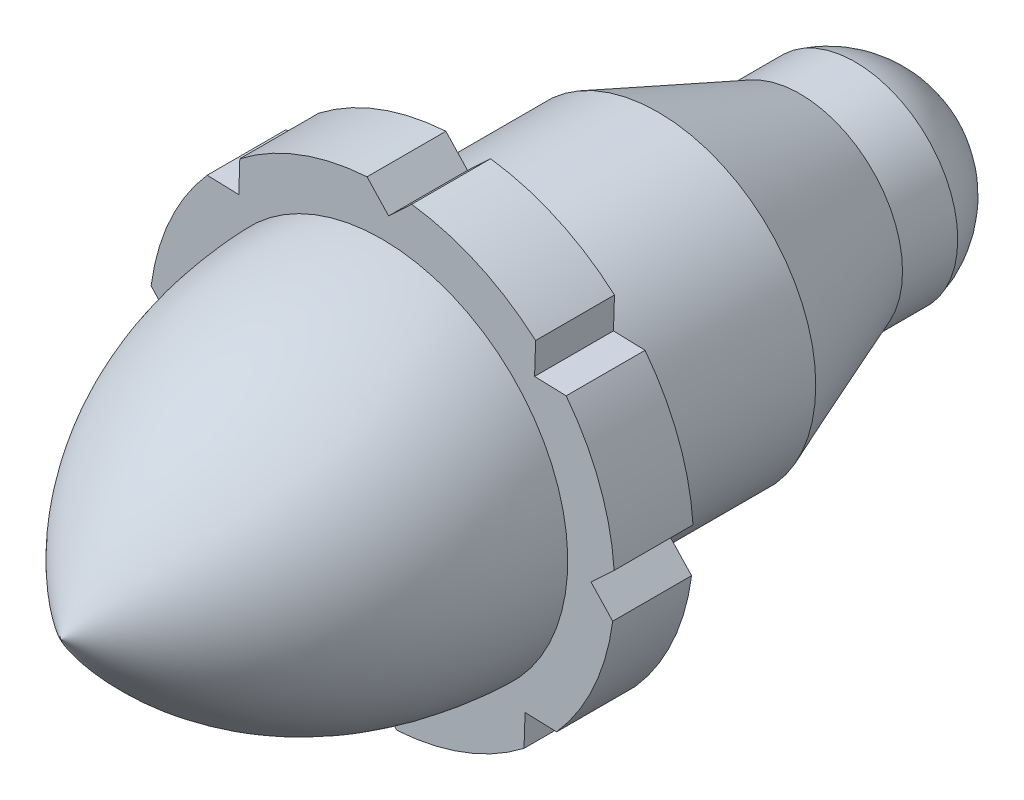
ISO-10303-21;
HEADER;
FILE_DESCRIPTION(('STEP AP214'),'2;1');
FILE_NAME('part.step','',(''),(''),'','','');
FILE_SCHEMA(('AUTOMOTIVE_DESIGN { 1 0 10303 214 1 1 1 1 }'));
ENDSEC;
DATA;
#1=APPLICATION_CONTEXT('core data for automotive mechanical design processes');
#2=APPLICATION_PROTOCOL_DEFINITION('international standard','automotive_design',2000,#1);
#3=PRODUCT_CONTEXT('',#1,'mechanical');
#4=PRODUCT('Part','Part','',(#3));
#5=PRODUCT_RELATED_PRODUCT_CATEGORY('part','',(#4));
#6=PRODUCT_DEFINITION_FORMATION('','',#4);
#7=PRODUCT_DEFINITION_CONTEXT('part definition',#1,'design');
#8=PRODUCT_DEFINITION('design','',#6,#7);
#9=PRODUCT_DEFINITION_SHAPE('','',#8);
#10=(LENGTH_UNIT() NAMED_UNIT(*) SI_UNIT(.MILLI.,.METRE.));
#11=(NAMED_UNIT(*) PLANE_ANGLE_UNIT() SI_UNIT($,.RADIAN.));
#12=(NAMED_UNIT(*) SI_UNIT($,.STERADIAN.) SOLID_ANGLE_UNIT());
#13=UNCERTAINTY_MEASURE_WITH_UNIT(LENGTH_MEASURE(1.E-05),#10,'distance_accuracy_value','');
#14=(GEOMETRIC_REPRESENTATION_CONTEXT(3) GLOBAL_UNCERTAINTY_ASSIGNED_CONTEXT((#13)) GLOBAL_UNIT_ASSIGNED_CONTEXT((#10,
#11,#12)) REPRESENTATION_CONTEXT('',''));
#15=CARTESIAN_POINT('',(0.,0.,0.));
#16=DIRECTION('',(0.,0.,1.));
#17=DIRECTION('',(1.,0.,0.));
#18=AXIS2_PLACEMENT_3D('',#15,#16,#17);
#19=CARTESIAN_POINT('',(0.,0.,12.0727628361858));
#20=DIRECTION('',(0.,0.,1.));
#21=DIRECTION('',(1.,0.,0.));
#22=AXIS2_PLACEMENT_3D('',#19,#20,#21);
#23=CYLINDRICAL_SURFACE('',#22,7.493);
#24=CARTESIAN_POINT('',(0.,0.,2.54));
#25=DIRECTION('',(0.,0.,1.));
#26=DIRECTION('',(1.,0.,0.));
#27=AXIS2_PLACEMENT_3D('',#24,#25,#26);
#28=CIRCLE('',#27,7.493);
#29=CARTESIAN_POINT('',(7.47765888228217,0.479235474716268,2.54));
#30=VERTEX_POINT('',#29);
#31=CARTESIAN_POINT('',(5.93327442458704,4.57616691156926,2.54));
#32=VERTEX_POINT('',#31);
#33=EDGE_CURVE('E310',#30,#32,#28,.T.);
#34=ORIENTED_EDGE('',*,*,#33,.F.);
#35=DIRECTION('',(0.,0.,1.));
#36=VECTOR('',#35,1.);
#37=CARTESIAN_POINT('',(7.47765888228217,0.479235474716268,-15.24));
#38=LINE('',#37,#36);
#39=CARTESIAN_POINT('',(7.47765888228217,0.479235474716268,0.));
#40=VERTEX_POINT('',#39);
#41=EDGE_CURVE('E312',#40,#30,#38,.T.);
#42=ORIENTED_EDGE('',*,*,#41,.F.);
#43=CARTESIAN_POINT('',(0.,0.,0.));
#44=DIRECTION('',(0.,0.,1.));
#45=DIRECTION('',(1.,0.,0.));
#46=AXIS2_PLACEMENT_3D('',#43,#44,#45);
#47=CIRCLE('',#46,7.493);
#48=CARTESIAN_POINT('',(5.93327442458704,4.57616691156926,0.));
#49=VERTEX_POINT('',#48);
#50=EDGE_CURVE('E635',#40,#49,#47,.T.);
#51=ORIENTED_EDGE('',*,*,#50,.T.);
#52=DIRECTION('',(0.,0.,1.));
#53=VECTOR('',#52,1.);
#54=CARTESIAN_POINT('',(5.93327442458704,4.57616691156926,-15.24));
#55=LINE('',#54,#53);
#56=EDGE_CURVE('E313',#49,#32,#55,.T.);
#57=ORIENTED_EDGE('',*,*,#56,.T.);
#58=EDGE_LOOP('',(#34,#42,#51,#57));
#59=FACE_BOUND('',#58,.T.);
#60=ADVANCED_FACE('F46',(#59),#23,.T.);
#61=CARTESIAN_POINT('',(5.62637395701856,-4.94863264910453,0.));
#62=VERTEX_POINT('',#61);
#63=CARTESIAN_POINT('',(7.43129723527833,-0.959619925254101,0.));
#64=VERTEX_POINT('',#63);
#65=EDGE_CURVE('E629',#62,#64,#47,.T.);
#66=ORIENTED_EDGE('',*,*,#65,.T.);
#67=DIRECTION('',(0.,0.,1.));
#68=VECTOR('',#67,1.);
#69=CARTESIAN_POINT('',(7.43129723527833,-0.959619925254101,-15.24));
#70=LINE('',#69,#68);
#71=CARTESIAN_POINT('',(7.43129723527833,-0.959619925254101,2.54));
#72=VERTEX_POINT('',#71);
#73=EDGE_CURVE('E699',#64,#72,#70,.T.);
#74=ORIENTED_EDGE('',*,*,#73,.T.);
#75=CARTESIAN_POINT('',(5.62637395701856,-4.94863264910453,2.54));
#76=VERTEX_POINT('',#75);
#77=EDGE_CURVE('E316',#76,#72,#28,.T.);
#78=ORIENTED_EDGE('',*,*,#77,.F.);
#79=DIRECTION('',(0.,0.,1.));
#80=VECTOR('',#79,1.);
#81=CARTESIAN_POINT('',(5.62637395701856,-4.94863264910453,-15.24));
#82=LINE('',#81,#80);
#83=EDGE_CURVE('E724',#62,#76,#82,.T.);
#84=ORIENTED_EDGE('',*,*,#83,.F.);
#85=EDGE_LOOP('',(#66,#74,#78,#84));
#86=FACE_BOUND('',#85,.T.);
#87=ADVANCED_FACE('F298',(#86),#23,.T.);
#88=CARTESIAN_POINT('',(0.479235474716294,-7.47765888228217,0.));
#89=VERTEX_POINT('',#88);
#90=CARTESIAN_POINT('',(4.57616691156924,-5.93327442458706,0.));
#91=VERTEX_POINT('',#90);
#92=EDGE_CURVE('E620',#89,#91,#47,.T.);
#93=ORIENTED_EDGE('',*,*,#92,.T.);
#94=DIRECTION('',(0.,0.,1.));
#95=VECTOR('',#94,1.);
#96=CARTESIAN_POINT('',(4.57616691156924,-5.93327442458706,-15.24));
#97=LINE('',#96,#95);
#98=CARTESIAN_POINT('',(4.57616691156924,-5.93327442458706,2.54));
#99=VERTEX_POINT('',#98);
#100=EDGE_CURVE('E622',#91,#99,#97,.T.);
#101=ORIENTED_EDGE('',*,*,#100,.T.);
#102=CARTESIAN_POINT('',(0.479235474716294,-7.47765888228217,2.54));
#103=VERTEX_POINT('',#102);
#104=EDGE_CURVE('E320',#103,#99,#28,.T.);
#105=ORIENTED_EDGE('',*,*,#104,.F.);
#106=DIRECTION('',(0.,0.,1.));
#107=VECTOR('',#106,1.);
#108=CARTESIAN_POINT('',(0.479235474716294,-7.47765888228217,-15.24));
#109=LINE('',#108,#107);
#110=EDGE_CURVE('E624',#89,#103,#109,.T.);
#111=ORIENTED_EDGE('',*,*,#110,.F.);
#112=EDGE_LOOP('',(#93,#101,#105,#111));
#113=FACE_BOUND('',#112,.T.);
#114=ADVANCED_FACE('F304',(#113),#23,.T.);
#115=CARTESIAN_POINT('',(-4.94863264910455,-5.62637395701855,0.));
#116=VERTEX_POINT('',#115);
#117=CARTESIAN_POINT('',(-0.959619925254075,-7.43129723527833,0.));
#118=VERTEX_POINT('',#117);
#119=EDGE_CURVE('E628',#116,#118,#47,.T.);
#120=ORIENTED_EDGE('',*,*,#119,.T.);
#121=DIRECTION('',(0.,0.,1.));
#122=VECTOR('',#121,1.);
#123=CARTESIAN_POINT('',(-0.959619925254075,-7.43129723527833,-15.24));
#124=LINE('',#123,#122);
#125=CARTESIAN_POINT('',(-0.959619925254075,-7.43129723527833,2.54));
#126=VERTEX_POINT('',#125);
#127=EDGE_CURVE('E740',#118,#126,#124,.T.);
#128=ORIENTED_EDGE('',*,*,#127,.T.);
#129=CARTESIAN_POINT('',(-4.94863264910455,-5.62637395701855,2.54));
#130=VERTEX_POINT('',#129);
#131=EDGE_CURVE('E250',#130,#126,#28,.T.);
#132=ORIENTED_EDGE('',*,*,#131,.F.);
#133=DIRECTION('',(0.,0.,1.));
#134=VECTOR('',#133,1.);
#135=CARTESIAN_POINT('',(-4.94863264910455,-5.62637395701855,-15.24));
#136=LINE('',#135,#134);
#137=EDGE_CURVE('E771',#116,#130,#136,.T.);
#138=ORIENTED_EDGE('',*,*,#137,.F.);
#139=EDGE_LOOP('',(#120,#128,#132,#138));
#140=FACE_BOUND('',#139,.T.);
#141=ADVANCED_FACE('F588',(#140),#23,.T.);
#142=CARTESIAN_POINT('',(-7.47765888228218,-0.479235474716216,0.));
#143=VERTEX_POINT('',#142);
#144=CARTESIAN_POINT('',(-5.93327442458708,-4.57616691156921,0.));
#145=VERTEX_POINT('',#144);
#146=EDGE_CURVE('E633',#143,#145,#47,.T.);
#147=ORIENTED_EDGE('',*,*,#146,.T.);
#148=DIRECTION('',(0.,0.,1.));
#149=VECTOR('',#148,1.);
#150=CARTESIAN_POINT('',(-5.93327442458708,-4.57616691156921,-15.24));
#151=LINE('',#150,#149);
#152=CARTESIAN_POINT('',(-5.93327442458708,-4.57616691156921,2.54));
#153=VERTEX_POINT('',#152);
#154=EDGE_CURVE('E763',#145,#153,#151,.T.);
#155=ORIENTED_EDGE('',*,*,#154,.T.);
#156=CARTESIAN_POINT('',(-7.47765888228218,-0.479235474716216,2.54));
#157=VERTEX_POINT('',#156);
#158=EDGE_CURVE('E243',#157,#153,#28,.T.);
#159=ORIENTED_EDGE('',*,*,#158,.F.);
#160=DIRECTION('',(0.,0.,1.));
#161=VECTOR('',#160,1.);
#162=CARTESIAN_POINT('',(-7.47765888228218,-0.479235474716216,-15.24));
#163=LINE('',#162,#161);
#164=EDGE_CURVE('E790',#143,#157,#163,.T.);
#165=ORIENTED_EDGE('',*,*,#164,.F.);
#166=EDGE_LOOP('',(#147,#155,#159,#165));
#167=FACE_BOUND('',#166,.T.);
#168=ADVANCED_FACE('F580',(#167),#23,.T.);
#169=CARTESIAN_POINT('',(-5.62637395701853,4.94863264910457,0.));
#170=VERTEX_POINT('',#169);
#171=CARTESIAN_POINT('',(-7.43129723527832,0.959619925254153,0.));
#172=VERTEX_POINT('',#171);
#173=EDGE_CURVE('E56',#170,#172,#47,.T.);
#174=ORIENTED_EDGE('',*,*,#173,.T.);
#175=DIRECTION('',(0.,0.,1.));
#176=VECTOR('',#175,1.);
#177=CARTESIAN_POINT('',(-7.43129723527832,0.959619925254153,-15.24));
#178=LINE('',#177,#176);
#179=CARTESIAN_POINT('',(-7.43129723527832,0.959619925254153,2.54));
#180=VERTEX_POINT('',#179);
#181=EDGE_CURVE('E217',#172,#180,#178,.T.);
#182=ORIENTED_EDGE('',*,*,#181,.T.);
#183=CARTESIAN_POINT('',(-5.62637395701853,4.94863264910457,2.54));
#184=VERTEX_POINT('',#183);
#185=EDGE_CURVE('E231',#184,#180,#28,.T.);
#186=ORIENTED_EDGE('',*,*,#185,.F.);
#187=DIRECTION('',(0.,0.,1.));
#188=VECTOR('',#187,1.);
#189=CARTESIAN_POINT('',(-5.62637395701853,4.94863264910457,-15.24));
#190=LINE('',#189,#188);
#191=EDGE_CURVE('E678',#170,#184,#190,.T.);
#192=ORIENTED_EDGE('',*,*,#191,.F.);
#193=EDGE_LOOP('',(#174,#182,#186,#192));
#194=FACE_BOUND('',#193,.T.);
#195=ADVANCED_FACE('F229',(#194),#23,.T.);
#196=CARTESIAN_POINT('',(4.94863264910451,5.62637395701858,2.54));
#197=VERTEX_POINT('',#196);
#198=CARTESIAN_POINT('',(0.959619925254075,7.43129723527833,2.54));
#199=VERTEX_POINT('',#198);
#200=EDGE_CURVE('E248',#197,#199,#28,.T.);
#201=ORIENTED_EDGE('',*,*,#200,.F.);
#202=DIRECTION('',(0.,0.,1.));
#203=VECTOR('',#202,1.);
#204=CARTESIAN_POINT('',(4.94863264910451,5.62637395701858,-15.24));
#205=LINE('',#204,#203);
#206=CARTESIAN_POINT('',(4.94863264910451,5.62637395701858,0.));
#207=VERTEX_POINT('',#206);
#208=EDGE_CURVE('E651',#207,#197,#205,.T.);
#209=ORIENTED_EDGE('',*,*,#208,.F.);
#210=CARTESIAN_POINT('',(0.959619925254075,7.43129723527833,0.));
#211=VERTEX_POINT('',#210);
#212=EDGE_CURVE('E57',#207,#211,#47,.T.);
#213=ORIENTED_EDGE('',*,*,#212,.T.);
#214=DIRECTION('',(0.,0.,1.));
#215=VECTOR('',#214,1.);
#216=CARTESIAN_POINT('',(0.959619925254075,7.43129723527833,-15.24));
#217=LINE('',#216,#215);
#218=EDGE_CURVE('E334',#211,#199,#217,.T.);
#219=ORIENTED_EDGE('',*,*,#218,.T.);
#220=EDGE_LOOP('',(#201,#209,#213,#219));
#221=FACE_BOUND('',#220,.T.);
#222=ADVANCED_FACE('F288',(#221),#23,.T.);
#223=CARTESIAN_POINT('',(0.,7.493,0.));
#224=DIRECTION('',(0.,0.,1.));
#225=DIRECTION('',(1.,0.,0.));
#226=AXIS2_PLACEMENT_3D('',#223,#224,#225);
#227=PLANE('',#226);
#228=ORIENTED_EDGE('',*,*,#50,.F.);
#229=DIRECTION('',(-0.729512016376307,-0.683967994837898,0.));
#230=VECTOR('',#229,1.);
#231=CARTESIAN_POINT('',(7.24670252932044,0.262697912504509,0.));
#232=LINE('',#231,#230);
#233=CARTESIAN_POINT('',(6.73505035879506,-0.217011401766994,0.));
#234=VERTEX_POINT('',#233);
#235=EDGE_CURVE('E644',#40,#234,#232,.T.);
#236=ORIENTED_EDGE('',*,*,#235,.T.);
#237=DIRECTION('',(0.6839679948379,-0.729512016376305,0.));
#238=VECTOR('',#237,1.);
#239=CARTESIAN_POINT('',(6.98134782947463,-0.47970931427153,0.));
#240=LINE('',#239,#238);
#241=EDGE_CURVE('E702',#234,#64,#240,.T.);
#242=ORIENTED_EDGE('',*,*,#241,.T.);
#243=ORIENTED_EDGE('',*,*,#65,.F.);
#244=DIRECTION('',(-0.999481301001201,0.0322044864723174,0.));
#245=VECTOR('',#244,1.);
#246=CARTESIAN_POINT('',(5.30994797505967,-4.93843702438871,0.));
#247=LINE('',#246,#245);
#248=CARTESIAN_POINT('',(4.60894954655263,-4.91585001412113,0.));
#249=VERTEX_POINT('',#248);
#250=EDGE_CURVE('E696',#62,#249,#247,.T.);
#251=ORIENTED_EDGE('',*,*,#250,.T.);
#252=DIRECTION('',(-0.0322044864723141,-0.999481301001202,0.));
#253=VECTOR('',#252,1.);
#254=CARTESIAN_POINT('',(4.59735268292374,-5.27576410116325,0.));
#255=LINE('',#254,#253);
#256=EDGE_CURVE('E721',#249,#91,#255,.T.);
#257=ORIENTED_EDGE('',*,*,#256,.T.);
#258=ORIENTED_EDGE('',*,*,#92,.F.);
#259=DIRECTION('',(-0.6839679948379,0.729512016376305,0.));
#260=VECTOR('',#259,1.);
#261=CARTESIAN_POINT('',(0.262697912504535,-7.24670252932044,0.));
#262=LINE('',#261,#260);
#263=CARTESIAN_POINT('',(-0.217011401766971,-6.73505035879507,0.));
#264=VERTEX_POINT('',#263);
#265=EDGE_CURVE('E716',#89,#264,#262,.T.);
#266=ORIENTED_EDGE('',*,*,#265,.T.);
#267=DIRECTION('',(-0.729512016376303,-0.683967994837903,0.));
#268=VECTOR('',#267,1.);
#269=CARTESIAN_POINT('',(-0.479709314271506,-6.98134782947463,0.));
#270=LINE('',#269,#268);
#271=EDGE_CURVE('E744',#264,#118,#270,.T.);
#272=ORIENTED_EDGE('',*,*,#271,.T.);
#273=ORIENTED_EDGE('',*,*,#119,.F.);
#274=DIRECTION('',(0.0322044864723209,0.999481301001201,0.));
#275=VECTOR('',#274,1.);
#276=CARTESIAN_POINT('',(-4.93843702438873,-5.30994797505965,0.));
#277=LINE('',#276,#275);
#278=CARTESIAN_POINT('',(-4.91585001412114,-4.60894954655261,0.));
#279=VERTEX_POINT('',#278);
#280=EDGE_CURVE('E736',#116,#279,#277,.T.);
#281=ORIENTED_EDGE('',*,*,#280,.T.);
#282=DIRECTION('',(-0.999481301001201,0.0322044864723175,0.));
#283=VECTOR('',#282,1.);
#284=CARTESIAN_POINT('',(-5.27576410116326,-4.59735268292372,0.));
#285=LINE('',#284,#283);
#286=EDGE_CURVE('E767',#279,#145,#285,.T.);
#287=ORIENTED_EDGE('',*,*,#286,.T.);
#288=ORIENTED_EDGE('',*,*,#146,.F.);
#289=DIRECTION('',(0.729512016376312,0.683967994837893,0.));
#290=VECTOR('',#289,1.);
#291=CARTESIAN_POINT('',(-7.24670252932044,-0.262697912504459,0.));
#292=LINE('',#291,#290);
#293=CARTESIAN_POINT('',(-6.73505035879506,0.217011401767041,0.));
#294=VERTEX_POINT('',#293);
#295=EDGE_CURVE('E759',#143,#294,#292,.T.);
#296=ORIENTED_EDGE('',*,*,#295,.T.);
#297=DIRECTION('',(-0.683967994837895,0.72951201637631,0.));
#298=VECTOR('',#297,1.);
#299=CARTESIAN_POINT('',(-6.98134782947462,0.479709314271579,0.));
#300=LINE('',#299,#298);
#301=EDGE_CURVE('E234',#294,#172,#300,.T.);
#302=ORIENTED_EDGE('',*,*,#301,.T.);
#303=ORIENTED_EDGE('',*,*,#173,.F.);
#304=DIRECTION('',(0.999481301001201,-0.0322044864723243,0.));
#305=VECTOR('',#304,1.);
#306=CARTESIAN_POINT('',(-5.30994797505964,4.93843702438875,0.));
#307=LINE('',#306,#305);
#308=CARTESIAN_POINT('',(-4.6089495465526,4.91585001412116,0.));
#309=VERTEX_POINT('',#308);
#310=EDGE_CURVE('E224',#170,#309,#307,.T.);
#311=ORIENTED_EDGE('',*,*,#310,.T.);
#312=DIRECTION('',(0.0322044864723209,0.999481301001201,0.));
#313=VECTOR('',#312,1.);
#314=CARTESIAN_POINT('',(-4.5973526829237,5.27576410116328,0.));
#315=LINE('',#314,#313);
#316=CARTESIAN_POINT('',(-4.5761669115692,5.93327442458709,0.));
#317=VERTEX_POINT('',#316);
#318=EDGE_CURVE('E673',#309,#317,#315,.T.);
#319=ORIENTED_EDGE('',*,*,#318,.T.);
#320=CARTESIAN_POINT('',(-0.479235474716294,7.47765888228217,0.));
#321=VERTEX_POINT('',#320);
#322=EDGE_CURVE('E12',#321,#317,#47,.T.);
#323=ORIENTED_EDGE('',*,*,#322,.F.);
#324=DIRECTION('',(0.6839679948379,-0.729512016376305,0.));
#325=VECTOR('',#324,1.);
#326=CARTESIAN_POINT('',(-0.262697912504535,7.24670252932044,0.));
#327=LINE('',#326,#325);
#328=CARTESIAN_POINT('',(0.217011401766971,6.73505035879507,0.));
#329=VERTEX_POINT('',#328);
#330=EDGE_CURVE('E353',#321,#329,#327,.T.);
#331=ORIENTED_EDGE('',*,*,#330,.T.);
#332=DIRECTION('',(0.729512016376303,0.683967994837903,0.));
#333=VECTOR('',#332,1.);
#334=CARTESIAN_POINT('',(0.479709314271506,6.98134782947463,0.));
#335=LINE('',#334,#333);
#336=EDGE_CURVE('E347',#329,#211,#335,.T.);
#337=ORIENTED_EDGE('',*,*,#336,.T.);
#338=ORIENTED_EDGE('',*,*,#212,.F.);
#339=DIRECTION('',(-0.0322044864723139,-0.999481301001202,0.));
#340=VECTOR('',#339,1.);
#341=CARTESIAN_POINT('',(4.93843702438869,5.30994797505969,0.));
#342=LINE('',#341,#340);
#343=CARTESIAN_POINT('',(4.91585001412111,4.60894954655265,0.));
#344=VERTEX_POINT('',#343);
#345=EDGE_CURVE('E648',#207,#344,#342,.T.);
#346=ORIENTED_EDGE('',*,*,#345,.T.);
#347=DIRECTION('',(0.999481301001202,-0.0322044864723105,0.));
#348=VECTOR('',#347,1.);
#349=CARTESIAN_POINT('',(5.27576410116323,4.59735268292375,0.));
#350=LINE('',#349,#348);
#351=EDGE_CURVE('E647',#344,#49,#350,.T.);
#352=ORIENTED_EDGE('',*,*,#351,.T.);
#353=EDGE_LOOP('',(#228,#236,#242,#243,#251,#257,#258,#266,#272,#273,#281,#287,#288,#296,#302,
#303,#311,#319,#323,#331,#337,#338,#346,#352));
#354=FACE_BOUND('',#353,.T.);
#355=CARTESIAN_POINT('',(0.,0.,0.));
#356=DIRECTION('',(0.,0.,1.));
#357=DIRECTION('',(1.,0.,0.));
#358=AXIS2_PLACEMENT_3D('',#355,#356,#357);
#359=CIRCLE('',#358,5.08);
#360=CARTESIAN_POINT('',(5.08,0.,0.));
#361=VERTEX_POINT('',#360);
#362=EDGE_CURVE('E252',#361,#361,#359,.T.);
#363=ORIENTED_EDGE('',*,*,#362,.T.);
#364=EDGE_LOOP('',(#363));
#365=FACE_BOUND('',#364,.T.);
#366=ADVANCED_FACE('F286',(#354,#365),#227,.F.);
#367=ORIENTED_EDGE('',*,*,#322,.T.);
#368=DIRECTION('',(0.,0.,1.));
#369=VECTOR('',#368,1.);
#370=CARTESIAN_POINT('',(-4.5761669115692,5.93327442458709,-15.24));
#371=LINE('',#370,#369);
#372=CARTESIAN_POINT('',(-4.5761669115692,5.93327442458709,2.54));
#373=VERTEX_POINT('',#372);
#374=EDGE_CURVE('E669',#317,#373,#371,.T.);
#375=ORIENTED_EDGE('',*,*,#374,.T.);
#376=CARTESIAN_POINT('',(-0.479235474716294,7.47765888228217,2.54));
#377=VERTEX_POINT('',#376);
#378=EDGE_CURVE('E242',#377,#373,#28,.T.);
#379=ORIENTED_EDGE('',*,*,#378,.F.);
#380=DIRECTION('',(0.,0.,1.));
#381=VECTOR('',#380,1.);
#382=CARTESIAN_POINT('',(-0.479235474716294,7.47765888228217,-15.24));
#383=LINE('',#382,#381);
#384=EDGE_CURVE('E343',#321,#377,#383,.T.);
#385=ORIENTED_EDGE('',*,*,#384,.F.);
#386=EDGE_LOOP('',(#367,#375,#379,#385));
#387=FACE_BOUND('',#386,.T.);
#388=ADVANCED_FACE('F283',(#387),#23,.T.);
#389=CARTESIAN_POINT('',(0.,0.,2.54));
#390=DIRECTION('',(0.,0.,-1.));
#391=DIRECTION('',(-1.,0.,0.));
#392=AXIS2_PLACEMENT_3D('',#389,#390,#391);
#393=PLANE('',#392);
#394=CARTESIAN_POINT('',(0.,0.,2.54));
#395=DIRECTION('',(0.,0.,-1.));
#396=DIRECTION('',(-1.,0.,0.));
#397=AXIS2_PLACEMENT_3D('',#394,#395,#396);
#398=CIRCLE('',#397,5.98409127133929);
#399=CARTESIAN_POINT('',(-5.98409127133929,0.,2.54));
#400=VERTEX_POINT('',#399);
#401=EDGE_CURVE('E256',#400,#400,#398,.T.);
#402=ORIENTED_EDGE('',*,*,#401,.T.);
#403=EDGE_LOOP('',(#402));
#404=FACE_BOUND('',#403,.T.);
#405=DIRECTION('',(0.6839679948379,-0.729512016376305,0.));
#406=VECTOR('',#405,1.);
#407=CARTESIAN_POINT('',(6.73505035879506,-0.217011401766994,2.54));
#408=LINE('',#407,#406);
#409=CARTESIAN_POINT('',(6.73505035879506,-0.217011401766994,2.54));
#410=VERTEX_POINT('',#409);
#411=EDGE_CURVE('E692',#410,#72,#408,.T.);
#412=ORIENTED_EDGE('',*,*,#411,.F.);
#413=DIRECTION('',(-0.729512016376307,-0.683967994837897,0.));
#414=VECTOR('',#413,1.);
#415=CARTESIAN_POINT('',(6.73505035879506,-0.217011401766994,2.54));
#416=LINE('',#415,#414);
#417=EDGE_CURVE('E64',#30,#410,#416,.T.);
#418=ORIENTED_EDGE('',*,*,#417,.F.);
#419=ORIENTED_EDGE('',*,*,#33,.T.);
#420=DIRECTION('',(0.999481301001202,-0.0322044864723105,0.));
#421=VECTOR('',#420,1.);
#422=CARTESIAN_POINT('',(4.91585001412111,4.60894954655265,2.54));
#423=LINE('',#422,#421);
#424=CARTESIAN_POINT('',(4.91585001412111,4.60894954655265,2.54));
#425=VERTEX_POINT('',#424);
#426=EDGE_CURVE('E711',#425,#32,#423,.T.);
#427=ORIENTED_EDGE('',*,*,#426,.F.);
#428=DIRECTION('',(-0.0322044864723139,-0.999481301001201,0.));
#429=VECTOR('',#428,1.);
#430=CARTESIAN_POINT('',(4.91585001412111,4.60894954655265,2.54));
#431=LINE('',#430,#429);
#432=EDGE_CURVE('E327',#197,#425,#431,.T.);
#433=ORIENTED_EDGE('',*,*,#432,.F.);
#434=ORIENTED_EDGE('',*,*,#200,.T.);
#435=DIRECTION('',(0.729512016376303,0.683967994837903,0.));
#436=VECTOR('',#435,1.);
#437=CARTESIAN_POINT('',(0.217011401766971,6.73505035879507,2.54));
#438=LINE('',#437,#436);
#439=CARTESIAN_POINT('',(0.217011401766971,6.73505035879507,2.54));
#440=VERTEX_POINT('',#439);
#441=EDGE_CURVE('E326',#440,#199,#438,.T.);
#442=ORIENTED_EDGE('',*,*,#441,.F.);
#443=DIRECTION('',(0.6839679948379,-0.729512016376305,0.));
#444=VECTOR('',#443,1.);
#445=CARTESIAN_POINT('',(0.217011401766971,6.73505035879507,2.54));
#446=LINE('',#445,#444);
#447=EDGE_CURVE('E339',#377,#440,#446,.T.);
#448=ORIENTED_EDGE('',*,*,#447,.F.);
#449=ORIENTED_EDGE('',*,*,#378,.T.);
#450=DIRECTION('',(0.0322044864723209,0.999481301001201,0.));
#451=VECTOR('',#450,1.);
#452=CARTESIAN_POINT('',(-4.6089495465526,4.91585001412116,2.54));
#453=LINE('',#452,#451);
#454=CARTESIAN_POINT('',(-4.6089495465526,4.91585001412116,2.54));
#455=VERTEX_POINT('',#454);
#456=EDGE_CURVE('E681',#455,#373,#453,.T.);
#457=ORIENTED_EDGE('',*,*,#456,.F.);
#458=DIRECTION('',(0.999481301001201,-0.0322044864723243,0.));
#459=VECTOR('',#458,1.);
#460=CARTESIAN_POINT('',(-4.6089495465526,4.91585001412116,2.54));
#461=LINE('',#460,#459);
#462=EDGE_CURVE('E240',#184,#455,#461,.T.);
#463=ORIENTED_EDGE('',*,*,#462,.F.);
#464=ORIENTED_EDGE('',*,*,#185,.T.);
#465=DIRECTION('',(-0.683967994837895,0.72951201637631,0.));
#466=VECTOR('',#465,1.);
#467=CARTESIAN_POINT('',(-6.73505035879506,0.217011401767041,2.54));
#468=LINE('',#467,#466);
#469=CARTESIAN_POINT('',(-6.73505035879506,0.217011401767042,2.54));
#470=VERTEX_POINT('',#469);
#471=EDGE_CURVE('E213',#470,#180,#468,.T.);
#472=ORIENTED_EDGE('',*,*,#471,.F.);
#473=DIRECTION('',(0.729512016376312,0.683967994837892,0.));
#474=VECTOR('',#473,1.);
#475=CARTESIAN_POINT('',(-6.73505035879506,0.217011401767041,2.54));
#476=LINE('',#475,#474);
#477=EDGE_CURVE('E787',#157,#470,#476,.T.);
#478=ORIENTED_EDGE('',*,*,#477,.F.);
#479=ORIENTED_EDGE('',*,*,#158,.T.);
#480=DIRECTION('',(-0.999481301001201,0.0322044864723175,0.));
#481=VECTOR('',#480,1.);
#482=CARTESIAN_POINT('',(-4.91585001412114,-4.60894954655261,2.54));
#483=LINE('',#482,#481);
#484=CARTESIAN_POINT('',(-4.91585001412114,-4.60894954655262,2.54));
#485=VERTEX_POINT('',#484);
#486=EDGE_CURVE('E755',#485,#153,#483,.T.);
#487=ORIENTED_EDGE('',*,*,#486,.F.);
#488=DIRECTION('',(0.0322044864723208,0.999481301001201,0.));
#489=VECTOR('',#488,1.);
#490=CARTESIAN_POINT('',(-4.91585001412114,-4.60894954655261,2.54));
#491=LINE('',#490,#489);
#492=EDGE_CURVE('E774',#130,#485,#491,.T.);
#493=ORIENTED_EDGE('',*,*,#492,.F.);
#494=ORIENTED_EDGE('',*,*,#131,.T.);
#495=DIRECTION('',(-0.729512016376303,-0.683967994837903,0.));
#496=VECTOR('',#495,1.);
#497=CARTESIAN_POINT('',(-0.217011401766971,-6.73505035879507,2.54));
#498=LINE('',#497,#496);
#499=CARTESIAN_POINT('',(-0.217011401766971,-6.73505035879507,2.54));
#500=VERTEX_POINT('',#499);
#501=EDGE_CURVE('E732',#500,#126,#498,.T.);
#502=ORIENTED_EDGE('',*,*,#501,.F.);
#503=DIRECTION('',(-0.6839679948379,0.729512016376305,0.));
#504=VECTOR('',#503,1.);
#505=CARTESIAN_POINT('',(-0.217011401766971,-6.73505035879507,2.54));
#506=LINE('',#505,#504);
#507=EDGE_CURVE('E750',#103,#500,#506,.T.);
#508=ORIENTED_EDGE('',*,*,#507,.F.);
#509=ORIENTED_EDGE('',*,*,#104,.T.);
#510=DIRECTION('',(-0.0322044864723141,-0.999481301001202,0.));
#511=VECTOR('',#510,1.);
#512=CARTESIAN_POINT('',(4.60894954655263,-4.91585001412113,2.54));
#513=LINE('',#512,#511);
#514=CARTESIAN_POINT('',(4.60894954655263,-4.91585001412113,2.54));
#515=VERTEX_POINT('',#514);
#516=EDGE_CURVE('E712',#515,#99,#513,.T.);
#517=ORIENTED_EDGE('',*,*,#516,.F.);
#518=DIRECTION('',(-0.999481301001201,0.0322044864723174,0.));
#519=VECTOR('',#518,1.);
#520=CARTESIAN_POINT('',(4.60894954655263,-4.91585001412113,2.54));
#521=LINE('',#520,#519);
#522=EDGE_CURVE('E72',#76,#515,#521,.T.);
#523=ORIENTED_EDGE('',*,*,#522,.F.);
#524=ORIENTED_EDGE('',*,*,#77,.T.);
#525=EDGE_LOOP('',(#412,#418,#419,#427,#433,#434,#442,#448,#449,#457,#463,#464,#472,#478,#479,
#487,#493,#494,#502,#508,#509,#517,#523,#524));
#526=FACE_BOUND('',#525,.T.);
#527=ADVANCED_FACE('F238',(#404,#526),#393,.F.);
#528=CARTESIAN_POINT('',(0.,0.,12.0727628361858));
#529=DIRECTION('',(0.,0.,1.));
#530=DIRECTION('',(1.,0.,0.));
#531=AXIS2_PLACEMENT_3D('',#528,#529,#530);
#532=CYLINDRICAL_SURFACE('',#531,5.08);
#533=CARTESIAN_POINT('',(0.,0.,-6.35));
#534=DIRECTION('',(0.,0.,1.));
#535=DIRECTION('',(1.,0.,0.));
#536=AXIS2_PLACEMENT_3D('',#533,#534,#535);
#537=CIRCLE('',#536,5.08);
#538=CARTESIAN_POINT('',(5.08,0.,-6.35));
#539=VERTEX_POINT('',#538);
#540=EDGE_CURVE('E356',#539,#539,#537,.T.);
#541=ORIENTED_EDGE('',*,*,#540,.T.);
#542=EDGE_LOOP('',(#541));
#543=FACE_BOUND('',#542,.T.);
#544=ORIENTED_EDGE('',*,*,#362,.F.);
#545=EDGE_LOOP('',(#544));
#546=FACE_BOUND('',#545,.T.);
#547=ADVANCED_FACE('F275',(#543,#546),#532,.T.);
#548=CARTESIAN_POINT('',(0.,5.98409127133929,2.54));
#549=CARTESIAN_POINT('',(0.,5.77091218441932,9.10319215006019));
#550=CARTESIAN_POINT('',(0.,0.,12.8875955655516));
#551=B_SPLINE_CURVE_WITH_KNOTS('',2,(#548,#549,#550),.UNSPECIFIED.,.F.,.F.,(3,3),(0.,1.),.UNSPECIFIED.);
#552=CARTESIAN_POINT('',(0.,0.,-12.7));
#553=DIRECTION('',(0.,0.,-1.));
#554=AXIS1_PLACEMENT('',#552,#553);
#555=SURFACE_OF_REVOLUTION('',#551,#554);
#556=CARTESIAN_POINT('',(0.,0.,12.8875955655516));
#557=VERTEX_POINT('',#556);
#558=VERTEX_LOOP('',#557);
#559=FACE_BOUND('',#558,.T.);
#560=ORIENTED_EDGE('',*,*,#401,.F.);
#561=EDGE_LOOP('',(#560));
#562=FACE_BOUND('',#561,.T.);
#563=ADVANCED_FACE('F270',(#559,#562),#555,.F.);
#564=CARTESIAN_POINT('',(0.,0.,0.));
#565=DIRECTION('',(0.,0.,1.));
#566=DIRECTION('',(1.,0.,0.));
#567=AXIS2_PLACEMENT_3D('',#564,#565,#566);
#568=CYLINDRICAL_SURFACE('',#567,3.302);
#569=CARTESIAN_POINT('',(0.,0.,-12.7));
#570=DIRECTION('',(0.,0.,1.));
#571=DIRECTION('',(1.,0.,0.));
#572=AXIS2_PLACEMENT_3D('',#569,#570,#571);
#573=CIRCLE('',#572,3.302);
#574=CARTESIAN_POINT('',(3.302,0.,-12.7));
#575=VERTEX_POINT('',#574);
#576=EDGE_CURVE('E50',#575,#575,#573,.T.);
#577=ORIENTED_EDGE('',*,*,#576,.T.);
#578=EDGE_LOOP('',(#577));
#579=FACE_BOUND('',#578,.T.);
#580=CARTESIAN_POINT('',(0.,0.,-10.922));
#581=DIRECTION('',(0.,0.,1.));
#582=DIRECTION('',(1.,0.,0.));
#583=AXIS2_PLACEMENT_3D('',#580,#581,#582);
#584=CIRCLE('',#583,3.302);
#585=CARTESIAN_POINT('',(3.302,0.,-10.922));
#586=VERTEX_POINT('',#585);
#587=EDGE_CURVE('E260',#586,#586,#584,.T.);
#588=ORIENTED_EDGE('',*,*,#587,.F.);
#589=EDGE_LOOP('',(#588));
#590=FACE_BOUND('',#589,.T.);
#591=ADVANCED_FACE('F274',(#579,#590),#568,.T.);
#592=CARTESIAN_POINT('',(0.,0.,-6.35));
#593=DIRECTION('',(0.,0.,1.));
#594=DIRECTION('',(1.,0.,0.));
#595=AXIS2_PLACEMENT_3D('',#592,#593,#594);
#596=CONICAL_SURFACE('',#595,5.08,0.370891288812663);
#597=ORIENTED_EDGE('',*,*,#587,.T.);
#598=EDGE_LOOP('',(#597));
#599=FACE_BOUND('',#598,.T.);
#600=ORIENTED_EDGE('',*,*,#540,.F.);
#601=EDGE_LOOP('',(#600));
#602=FACE_BOUND('',#601,.T.);
#603=ADVANCED_FACE('F370',(#599,#602),#596,.T.);
#604=CARTESIAN_POINT('',(0.,0.,-11.8237));
#605=DIRECTION('',(0.,0.,1.));
#606=DIRECTION('',(1.,0.,0.));
#607=AXIS2_PLACEMENT_3D('',#604,#605,#606);
#608=SPHERICAL_SURFACE('',#607,3.4163);
#609=ORIENTED_EDGE('',*,*,#576,.F.);
#610=EDGE_LOOP('',(#609));
#611=FACE_BOUND('',#610,.T.);
#612=ADVANCED_FACE('F48',(#611),#608,.T.);
#613=CARTESIAN_POINT('',(0.217011401766971,6.73505035879507,-15.24));
#614=DIRECTION('',(-0.729512016376305,-0.6839679948379,0.));
#615=DIRECTION('',(0.6839679948379,-0.729512016376305,0.));
#616=AXIS2_PLACEMENT_3D('',#613,#614,#615);
#617=PLANE('',#616);
#618=ORIENTED_EDGE('',*,*,#384,.T.);
#619=ORIENTED_EDGE('',*,*,#447,.T.);
#620=DIRECTION('',(0.,0.,1.));
#621=VECTOR('',#620,1.);
#622=CARTESIAN_POINT('',(0.217011401766971,6.73505035879507,-15.24));
#623=LINE('',#622,#621);
#624=EDGE_CURVE('E337',#329,#440,#623,.T.);
#625=ORIENTED_EDGE('',*,*,#624,.F.);
#626=ORIENTED_EDGE('',*,*,#330,.F.);
#627=EDGE_LOOP('',(#618,#619,#625,#626));
#628=FACE_BOUND('',#627,.T.);
#629=ADVANCED_FACE('F369',(#628),#617,.F.);
#630=CARTESIAN_POINT('',(0.217011401766971,6.73505035879507,-15.24));
#631=DIRECTION('',(0.683967994837903,-0.729512016376303,0.));
#632=DIRECTION('',(0.729512016376303,0.683967994837903,0.));
#633=AXIS2_PLACEMENT_3D('',#630,#631,#632);
#634=PLANE('',#633);
#635=ORIENTED_EDGE('',*,*,#624,.T.);
#636=ORIENTED_EDGE('',*,*,#441,.T.);
#637=ORIENTED_EDGE('',*,*,#218,.F.);
#638=ORIENTED_EDGE('',*,*,#336,.F.);
#639=EDGE_LOOP('',(#635,#636,#637,#638));
#640=FACE_BOUND('',#639,.T.);
#641=ADVANCED_FACE('F333',(#640),#634,.F.);
#642=CARTESIAN_POINT('',(4.91585001412111,4.60894954655265,-15.24));
#643=DIRECTION('',(-0.999481301001201,0.0322044864723139,0.));
#644=DIRECTION('',(-0.0322044864723139,-0.999481301001202,0.));
#645=AXIS2_PLACEMENT_3D('',#642,#643,#644);
#646=PLANE('',#645);
#647=ORIENTED_EDGE('',*,*,#208,.T.);
#648=ORIENTED_EDGE('',*,*,#432,.T.);
#649=DIRECTION('',(0.,0.,1.));
#650=VECTOR('',#649,1.);
#651=CARTESIAN_POINT('',(4.91585001412111,4.60894954655265,-15.24));
#652=LINE('',#651,#650);
#653=EDGE_CURVE('E656',#344,#425,#652,.T.);
#654=ORIENTED_EDGE('',*,*,#653,.F.);
#655=ORIENTED_EDGE('',*,*,#345,.F.);
#656=EDGE_LOOP('',(#647,#648,#654,#655));
#657=FACE_BOUND('',#656,.T.);
#658=ADVANCED_FACE('F384',(#657),#646,.F.);
#659=CARTESIAN_POINT('',(4.91585001412111,4.60894954655265,-15.24));
#660=DIRECTION('',(-0.0322044864723105,-0.999481301001202,0.));
#661=DIRECTION('',(0.999481301001202,-0.0322044864723105,0.));
#662=AXIS2_PLACEMENT_3D('',#659,#660,#661);
#663=PLANE('',#662);
#664=ORIENTED_EDGE('',*,*,#653,.T.);
#665=ORIENTED_EDGE('',*,*,#426,.T.);
#666=ORIENTED_EDGE('',*,*,#56,.F.);
#667=ORIENTED_EDGE('',*,*,#351,.F.);
#668=EDGE_LOOP('',(#664,#665,#666,#667));
#669=FACE_BOUND('',#668,.T.);
#670=ADVANCED_FACE('F387',(#669),#663,.F.);
#671=CARTESIAN_POINT('',(-4.6089495465526,4.91585001412116,-15.24));
#672=DIRECTION('',(-0.0322044864723243,-0.999481301001201,0.));
#673=DIRECTION('',(0.999481301001201,-0.0322044864723243,0.));
#674=AXIS2_PLACEMENT_3D('',#671,#672,#673);
#675=PLANE('',#674);
#676=ORIENTED_EDGE('',*,*,#191,.T.);
#677=ORIENTED_EDGE('',*,*,#462,.T.);
#678=DIRECTION('',(0.,0.,1.));
#679=VECTOR('',#678,1.);
#680=CARTESIAN_POINT('',(-4.6089495465526,4.91585001412116,-15.24));
#681=LINE('',#680,#679);
#682=EDGE_CURVE('E674',#309,#455,#681,.T.);
#683=ORIENTED_EDGE('',*,*,#682,.F.);
#684=ORIENTED_EDGE('',*,*,#310,.F.);
#685=EDGE_LOOP('',(#676,#677,#683,#684));
#686=FACE_BOUND('',#685,.T.);
#687=ADVANCED_FACE('F391',(#686),#675,.F.);
#688=CARTESIAN_POINT('',(-4.6089495465526,4.91585001412116,-15.24));
#689=DIRECTION('',(0.999481301001201,-0.0322044864723209,0.));
#690=DIRECTION('',(0.0322044864723209,0.999481301001201,0.));
#691=AXIS2_PLACEMENT_3D('',#688,#689,#690);
#692=PLANE('',#691);
#693=ORIENTED_EDGE('',*,*,#682,.T.);
#694=ORIENTED_EDGE('',*,*,#456,.T.);
#695=ORIENTED_EDGE('',*,*,#374,.F.);
#696=ORIENTED_EDGE('',*,*,#318,.F.);
#697=EDGE_LOOP('',(#693,#694,#695,#696));
#698=FACE_BOUND('',#697,.T.);
#699=ADVANCED_FACE('F425',(#698),#692,.F.);
#700=CARTESIAN_POINT('',(-6.73505035879506,0.217011401767041,-15.24));
#701=DIRECTION('',(0.683967994837892,-0.729512016376312,0.));
#702=DIRECTION('',(0.729512016376312,0.683967994837893,0.));
#703=AXIS2_PLACEMENT_3D('',#700,#701,#702);
#704=PLANE('',#703);
#705=ORIENTED_EDGE('',*,*,#164,.T.);
#706=ORIENTED_EDGE('',*,*,#477,.T.);
#707=DIRECTION('',(0.,0.,1.));
#708=VECTOR('',#707,1.);
#709=CARTESIAN_POINT('',(-6.73505035879506,0.217011401767041,-15.24));
#710=LINE('',#709,#708);
#711=EDGE_CURVE('E219',#294,#470,#710,.T.);
#712=ORIENTED_EDGE('',*,*,#711,.F.);
#713=ORIENTED_EDGE('',*,*,#295,.F.);
#714=EDGE_LOOP('',(#705,#706,#712,#713));
#715=FACE_BOUND('',#714,.T.);
#716=ADVANCED_FACE('F429',(#715),#704,.F.);
#717=CARTESIAN_POINT('',(-6.73505035879506,0.217011401767041,-15.24));
#718=DIRECTION('',(0.72951201637631,0.683967994837895,0.));
#719=DIRECTION('',(-0.683967994837895,0.72951201637631,0.));
#720=AXIS2_PLACEMENT_3D('',#717,#718,#719);
#721=PLANE('',#720);
#722=ORIENTED_EDGE('',*,*,#711,.T.);
#723=ORIENTED_EDGE('',*,*,#471,.T.);
#724=ORIENTED_EDGE('',*,*,#181,.F.);
#725=ORIENTED_EDGE('',*,*,#301,.F.);
#726=EDGE_LOOP('',(#722,#723,#724,#725));
#727=FACE_BOUND('',#726,.T.);
#728=ADVANCED_FACE('F215',(#727),#721,.F.);
#729=CARTESIAN_POINT('',(-4.91585001412114,-4.60894954655261,-15.24));
#730=DIRECTION('',(0.999481301001201,-0.0322044864723208,0.));
#731=DIRECTION('',(0.0322044864723209,0.999481301001201,0.));
#732=AXIS2_PLACEMENT_3D('',#729,#730,#731);
#733=PLANE('',#732);
#734=ORIENTED_EDGE('',*,*,#137,.T.);
#735=ORIENTED_EDGE('',*,*,#492,.T.);
#736=DIRECTION('',(0.,0.,1.));
#737=VECTOR('',#736,1.);
#738=CARTESIAN_POINT('',(-4.91585001412114,-4.60894954655261,-15.24));
#739=LINE('',#738,#737);
#740=EDGE_CURVE('E758',#279,#485,#739,.T.);
#741=ORIENTED_EDGE('',*,*,#740,.F.);
#742=ORIENTED_EDGE('',*,*,#280,.F.);
#743=EDGE_LOOP('',(#734,#735,#741,#742));
#744=FACE_BOUND('',#743,.T.);
#745=ADVANCED_FACE('F393',(#744),#733,.F.);
#746=CARTESIAN_POINT('',(-4.91585001412114,-4.60894954655261,-15.24));
#747=DIRECTION('',(0.0322044864723175,0.999481301001201,0.));
#748=DIRECTION('',(-0.999481301001201,0.0322044864723175,0.));
#749=AXIS2_PLACEMENT_3D('',#746,#747,#748);
#750=PLANE('',#749);
#751=ORIENTED_EDGE('',*,*,#740,.T.);
#752=ORIENTED_EDGE('',*,*,#486,.T.);
#753=ORIENTED_EDGE('',*,*,#154,.F.);
#754=ORIENTED_EDGE('',*,*,#286,.F.);
#755=EDGE_LOOP('',(#751,#752,#753,#754));
#756=FACE_BOUND('',#755,.T.);
#757=ADVANCED_FACE('F396',(#756),#750,.F.);
#758=CARTESIAN_POINT('',(-0.217011401766971,-6.73505035879507,-15.24));
#759=DIRECTION('',(0.729512016376305,0.6839679948379,0.));
#760=DIRECTION('',(-0.6839679948379,0.729512016376305,0.));
#761=AXIS2_PLACEMENT_3D('',#758,#759,#760);
#762=PLANE('',#761);
#763=ORIENTED_EDGE('',*,*,#110,.T.);
#764=ORIENTED_EDGE('',*,*,#507,.T.);
#765=DIRECTION('',(0.,0.,1.));
#766=VECTOR('',#765,1.);
#767=CARTESIAN_POINT('',(-0.217011401766971,-6.73505035879507,-15.24));
#768=LINE('',#767,#766);
#769=EDGE_CURVE('E735',#264,#500,#768,.T.);
#770=ORIENTED_EDGE('',*,*,#769,.F.);
#771=ORIENTED_EDGE('',*,*,#265,.F.);
#772=EDGE_LOOP('',(#763,#764,#770,#771));
#773=FACE_BOUND('',#772,.T.);
#774=ADVANCED_FACE('F400',(#773),#762,.F.);
#775=CARTESIAN_POINT('',(-0.217011401766971,-6.73505035879507,-15.24));
#776=DIRECTION('',(-0.683967994837903,0.729512016376303,0.));
#777=DIRECTION('',(-0.729512016376303,-0.683967994837903,0.));
#778=AXIS2_PLACEMENT_3D('',#775,#776,#777);
#779=PLANE('',#778);
#780=ORIENTED_EDGE('',*,*,#769,.T.);
#781=ORIENTED_EDGE('',*,*,#501,.T.);
#782=ORIENTED_EDGE('',*,*,#127,.F.);
#783=ORIENTED_EDGE('',*,*,#271,.F.);
#784=EDGE_LOOP('',(#780,#781,#782,#783));
#785=FACE_BOUND('',#784,.T.);
#786=ADVANCED_FACE('F404',(#785),#779,.F.);
#787=CARTESIAN_POINT('',(4.60894954655263,-4.91585001412113,-15.24));
#788=DIRECTION('',(0.0322044864723174,0.999481301001201,0.));
#789=DIRECTION('',(-0.999481301001201,0.0322044864723174,0.));
#790=AXIS2_PLACEMENT_3D('',#787,#788,#789);
#791=PLANE('',#790);
#792=ORIENTED_EDGE('',*,*,#83,.T.);
#793=ORIENTED_EDGE('',*,*,#522,.T.);
#794=DIRECTION('',(0.,0.,1.));
#795=VECTOR('',#794,1.);
#796=CARTESIAN_POINT('',(4.60894954655263,-4.91585001412113,-15.24));
#797=LINE('',#796,#795);
#798=EDGE_CURVE('E715',#249,#515,#797,.T.);
#799=ORIENTED_EDGE('',*,*,#798,.F.);
#800=ORIENTED_EDGE('',*,*,#250,.F.);
#801=EDGE_LOOP('',(#792,#793,#799,#800));
#802=FACE_BOUND('',#801,.T.);
#803=ADVANCED_FACE('F408',(#802),#791,.F.);
#804=CARTESIAN_POINT('',(4.60894954655263,-4.91585001412113,-15.24));
#805=DIRECTION('',(-0.999481301001202,0.0322044864723141,0.));
#806=DIRECTION('',(-0.0322044864723141,-0.999481301001202,0.));
#807=AXIS2_PLACEMENT_3D('',#804,#805,#806);
#808=PLANE('',#807);
#809=ORIENTED_EDGE('',*,*,#798,.T.);
#810=ORIENTED_EDGE('',*,*,#516,.T.);
#811=ORIENTED_EDGE('',*,*,#100,.F.);
#812=ORIENTED_EDGE('',*,*,#256,.F.);
#813=EDGE_LOOP('',(#809,#810,#811,#812));
#814=FACE_BOUND('',#813,.T.);
#815=ADVANCED_FACE('F412',(#814),#808,.F.);
#816=CARTESIAN_POINT('',(6.73505035879506,-0.217011401766994,-15.24));
#817=DIRECTION('',(-0.683967994837897,0.729512016376307,0.));
#818=DIRECTION('',(-0.729512016376307,-0.683967994837898,0.));
#819=AXIS2_PLACEMENT_3D('',#816,#817,#818);
#820=PLANE('',#819);
#821=ORIENTED_EDGE('',*,*,#41,.T.);
#822=ORIENTED_EDGE('',*,*,#417,.T.);
#823=DIRECTION('',(0.,0.,1.));
#824=VECTOR('',#823,1.);
#825=CARTESIAN_POINT('',(6.73505035879506,-0.217011401766994,-15.24));
#826=LINE('',#825,#824);
#827=EDGE_CURVE('E695',#234,#410,#826,.T.);
#828=ORIENTED_EDGE('',*,*,#827,.F.);
#829=ORIENTED_EDGE('',*,*,#235,.F.);
#830=EDGE_LOOP('',(#821,#822,#828,#829));
#831=FACE_BOUND('',#830,.T.);
#832=ADVANCED_FACE('F415',(#831),#820,.F.);
#833=CARTESIAN_POINT('',(6.73505035879506,-0.217011401766994,-15.24));
#834=DIRECTION('',(-0.729512016376305,-0.6839679948379,0.));
#835=DIRECTION('',(0.6839679948379,-0.729512016376305,0.));
#836=AXIS2_PLACEMENT_3D('',#833,#834,#835);
#837=PLANE('',#836);
#838=ORIENTED_EDGE('',*,*,#827,.T.);
#839=ORIENTED_EDGE('',*,*,#411,.T.);
#840=ORIENTED_EDGE('',*,*,#73,.F.);
#841=ORIENTED_EDGE('',*,*,#241,.F.);
#842=EDGE_LOOP('',(#838,#839,#840,#841));
#843=FACE_BOUND('',#842,.T.);
#844=ADVANCED_FACE('F419',(#843),#837,.F.);
#845=CLOSED_SHELL('',(#60,#87,#114,#141,#168,#195,#222,#366,#388,#527,#547,#563,#591,#603,#612,
#629,#641,#658,#670,#687,#699,#716,#728,#745,#757,#774,#786,#803,#815,#832,#844));
#846=MANIFOLD_SOLID_BREP('B2',#845);
#847=ADVANCED_BREP_SHAPE_REPRESENTATION('',(#18,#846),#14);
#848=SHAPE_DEFINITION_REPRESENTATION(#9,#847);
ENDSEC;
END-ISO-10303-21;
